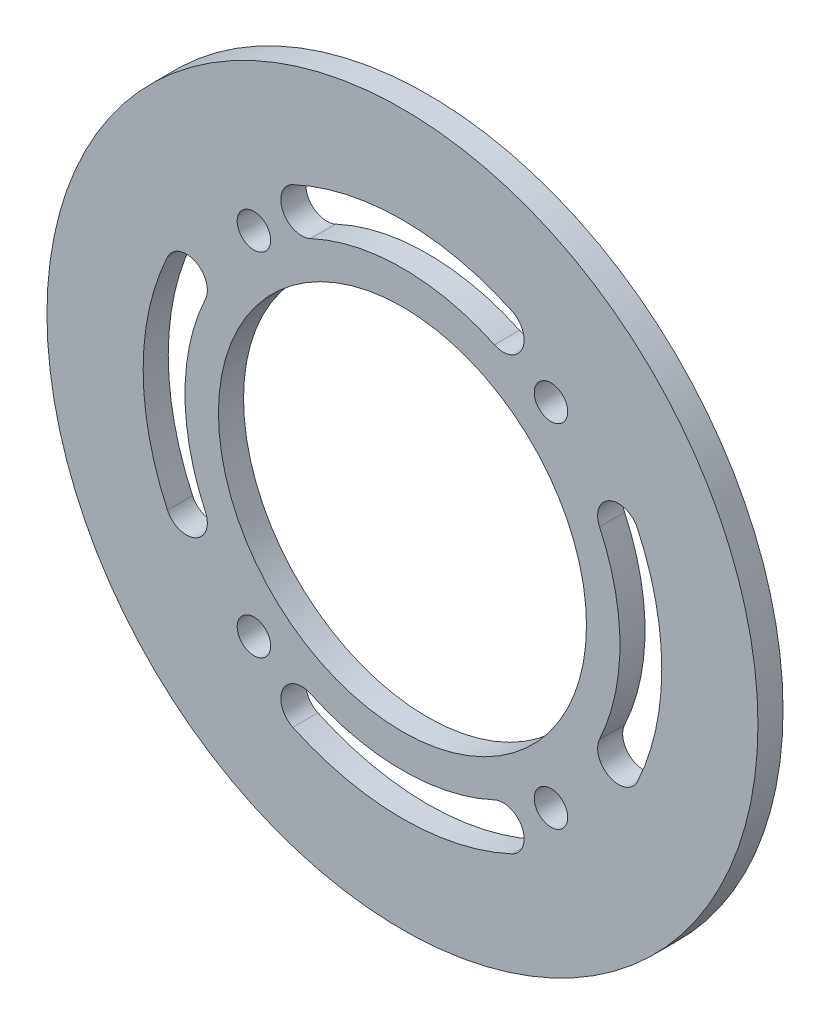
ISO-10303-21;
HEADER;
FILE_DESCRIPTION(('STEP AP214'),'2;1');
FILE_NAME('part.step','',(''),(''),'','','');
FILE_SCHEMA(('AUTOMOTIVE_DESIGN { 1 0 10303 214 1 1 1 1 }'));
ENDSEC;
DATA;
#1=APPLICATION_CONTEXT('core data for automotive mechanical design processes');
#2=APPLICATION_PROTOCOL_DEFINITION('international standard','automotive_design',2000,#1);
#3=PRODUCT_CONTEXT('',#1,'mechanical');
#4=PRODUCT('Part','Part','',(#3));
#5=PRODUCT_RELATED_PRODUCT_CATEGORY('part','',(#4));
#6=PRODUCT_DEFINITION_FORMATION('','',#4);
#7=PRODUCT_DEFINITION_CONTEXT('part definition',#1,'design');
#8=PRODUCT_DEFINITION('design','',#6,#7);
#9=PRODUCT_DEFINITION_SHAPE('','',#8);
#10=(LENGTH_UNIT() NAMED_UNIT(*) SI_UNIT(.MILLI.,.METRE.));
#11=(NAMED_UNIT(*) PLANE_ANGLE_UNIT() SI_UNIT($,.RADIAN.));
#12=(NAMED_UNIT(*) SI_UNIT($,.STERADIAN.) SOLID_ANGLE_UNIT());
#13=UNCERTAINTY_MEASURE_WITH_UNIT(LENGTH_MEASURE(1.E-05),#10,'distance_accuracy_value','');
#14=(GEOMETRIC_REPRESENTATION_CONTEXT(3) GLOBAL_UNCERTAINTY_ASSIGNED_CONTEXT((#13)) GLOBAL_UNIT_ASSIGNED_CONTEXT((#10,
#11,#12)) REPRESENTATION_CONTEXT('',''));
#15=CARTESIAN_POINT('',(0.,0.,0.));
#16=DIRECTION('',(0.,0.,1.));
#17=DIRECTION('',(1.,0.,0.));
#18=AXIS2_PLACEMENT_3D('',#15,#16,#17);
#19=CARTESIAN_POINT('',(0.,0.,20.));
#20=DIRECTION('',(0.,0.,-1.));
#21=DIRECTION('',(-1.,0.,0.));
#22=AXIS2_PLACEMENT_3D('',#19,#20,#21);
#23=CYLINDRICAL_SURFACE('',#22,22.);
#24=CARTESIAN_POINT('',(0.,0.,20.));
#25=DIRECTION('',(0.,0.,1.));
#26=DIRECTION('',(1.,0.,0.));
#27=AXIS2_PLACEMENT_3D('',#24,#25,#26);
#28=CIRCLE('',#27,22.);
#29=CARTESIAN_POINT('',(22.,0.,20.));
#30=VERTEX_POINT('',#29);
#31=EDGE_CURVE('E171',#30,#30,#28,.T.);
#32=ORIENTED_EDGE('',*,*,#31,.F.);
#33=EDGE_LOOP('',(#32));
#34=FACE_BOUND('',#33,.T.);
#35=CARTESIAN_POINT('',(0.,0.,23.));
#36=DIRECTION('',(0.,0.,1.));
#37=DIRECTION('',(1.,0.,0.));
#38=AXIS2_PLACEMENT_3D('',#35,#36,#37);
#39=CIRCLE('',#38,22.);
#40=CARTESIAN_POINT('',(22.,0.,23.));
#41=VERTEX_POINT('',#40);
#42=EDGE_CURVE('E307',#41,#41,#39,.T.);
#43=ORIENTED_EDGE('',*,*,#42,.T.);
#44=EDGE_LOOP('',(#43));
#45=FACE_BOUND('',#44,.T.);
#46=ADVANCED_FACE('F36',(#34,#45),#23,.F.);
#47=CARTESIAN_POINT('',(0.,0.,23.));
#48=DIRECTION('',(0.,0.,1.));
#49=DIRECTION('',(1.,0.,0.));
#50=AXIS2_PLACEMENT_3D('',#47,#48,#49);
#51=PLANE('',#50);
#52=CARTESIAN_POINT('',(-17.7552809045647,-21.,23.));
#53=DIRECTION('',(0.,0.,1.));
#54=DIRECTION('',(1.,0.,0.));
#55=AXIS2_PLACEMENT_3D('',#52,#53,#54);
#56=CIRCLE('',#55,2.00000000000001);
#57=CARTESIAN_POINT('',(-15.7552809045647,-21.,23.));
#58=VERTEX_POINT('',#57);
#59=EDGE_CURVE('E215',#58,#58,#56,.F.);
#60=ORIENTED_EDGE('',*,*,#59,.T.);
#61=EDGE_LOOP('',(#60));
#62=FACE_BOUND('',#61,.T.);
#63=CARTESIAN_POINT('',(17.7552809045647,21.,23.));
#64=DIRECTION('',(0.,0.,1.));
#65=DIRECTION('',(1.,0.,0.));
#66=AXIS2_PLACEMENT_3D('',#63,#64,#65);
#67=CIRCLE('',#66,2.00000000000001);
#68=CARTESIAN_POINT('',(19.7552809045647,21.,23.));
#69=VERTEX_POINT('',#68);
#70=EDGE_CURVE('E225',#69,#69,#67,.F.);
#71=ORIENTED_EDGE('',*,*,#70,.T.);
#72=EDGE_LOOP('',(#71));
#73=FACE_BOUND('',#72,.T.);
#74=CARTESIAN_POINT('',(-17.7552809045647,21.,23.));
#75=DIRECTION('',(0.,0.,1.));
#76=DIRECTION('',(1.,0.,0.));
#77=AXIS2_PLACEMENT_3D('',#74,#75,#76);
#78=CIRCLE('',#77,2.00000000000001);
#79=CARTESIAN_POINT('',(-15.7552809045647,21.,23.));
#80=VERTEX_POINT('',#79);
#81=EDGE_CURVE('E222',#80,#80,#78,.F.);
#82=ORIENTED_EDGE('',*,*,#81,.T.);
#83=EDGE_LOOP('',(#82));
#84=FACE_BOUND('',#83,.T.);
#85=CARTESIAN_POINT('',(17.7552809045647,-21.,23.));
#86=DIRECTION('',(0.,0.,1.));
#87=DIRECTION('',(1.,0.,0.));
#88=AXIS2_PLACEMENT_3D('',#85,#86,#87);
#89=CIRCLE('',#88,2.00000000000001);
#90=CARTESIAN_POINT('',(19.7552809045647,-21.,23.));
#91=VERTEX_POINT('',#90);
#92=EDGE_CURVE('E219',#91,#91,#89,.F.);
#93=ORIENTED_EDGE('',*,*,#92,.T.);
#94=EDGE_LOOP('',(#93));
#95=FACE_BOUND('',#94,.T.);
#96=CARTESIAN_POINT('',(25.8297719305445,-12.04462045961,23.));
#97=DIRECTION('',(0.,0.,1.));
#98=DIRECTION('',(1.,0.,0.));
#99=AXIS2_PLACEMENT_3D('',#96,#97,#98);
#100=CIRCLE('',#99,2.5);
#101=CARTESIAN_POINT('',(23.5640024629529,-10.9880748052582,23.));
#102=VERTEX_POINT('',#101);
#103=CARTESIAN_POINT('',(28.0955413981361,-13.1011661139617,23.));
#104=VERTEX_POINT('',#103);
#105=EDGE_CURVE('E305',#102,#104,#100,.T.);
#106=ORIENTED_EDGE('',*,*,#105,.F.);
#107=CARTESIAN_POINT('',(0.,0.,23.));
#108=DIRECTION('',(0.,0.,1.));
#109=DIRECTION('',(1.,0.,0.));
#110=AXIS2_PLACEMENT_3D('',#107,#108,#109);
#111=CIRCLE('',#110,26.);
#112=CARTESIAN_POINT('',(23.5640024629529,10.9880748052582,23.));
#113=VERTEX_POINT('',#112);
#114=EDGE_CURVE('E303',#113,#102,#111,.F.);
#115=ORIENTED_EDGE('',*,*,#114,.F.);
#116=CARTESIAN_POINT('',(25.8297719305445,12.04462045961,23.));
#117=DIRECTION('',(0.,0.,1.));
#118=DIRECTION('',(1.,0.,0.));
#119=AXIS2_PLACEMENT_3D('',#116,#117,#118);
#120=CIRCLE('',#119,2.5);
#121=CARTESIAN_POINT('',(28.0955413981361,13.1011661139617,23.));
#122=VERTEX_POINT('',#121);
#123=EDGE_CURVE('E301',#122,#113,#120,.T.);
#124=ORIENTED_EDGE('',*,*,#123,.F.);
#125=CARTESIAN_POINT('',(0.,0.,23.));
#126=DIRECTION('',(0.,0.,1.));
#127=DIRECTION('',(1.,0.,0.));
#128=AXIS2_PLACEMENT_3D('',#125,#126,#127);
#129=CIRCLE('',#128,31.);
#130=EDGE_CURVE('E299',#104,#122,#129,.T.);
#131=ORIENTED_EDGE('',*,*,#130,.F.);
#132=EDGE_LOOP('',(#106,#115,#124,#131));
#133=FACE_BOUND('',#132,.T.);
#134=CARTESIAN_POINT('',(-12.04462045961,-25.8297719305445,23.));
#135=DIRECTION('',(0.,0.,1.));
#136=DIRECTION('',(1.,0.,0.));
#137=AXIS2_PLACEMENT_3D('',#134,#135,#136);
#138=CIRCLE('',#137,2.5);
#139=CARTESIAN_POINT('',(-10.9880748052583,-23.5640024629528,23.));
#140=VERTEX_POINT('',#139);
#141=CARTESIAN_POINT('',(-13.1011661139617,-28.0955413981361,23.));
#142=VERTEX_POINT('',#141);
#143=EDGE_CURVE('E297',#140,#142,#138,.T.);
#144=ORIENTED_EDGE('',*,*,#143,.F.);
#145=CARTESIAN_POINT('',(0.,0.,23.));
#146=DIRECTION('',(0.,0.,1.));
#147=DIRECTION('',(1.,0.,0.));
#148=AXIS2_PLACEMENT_3D('',#145,#146,#147);
#149=CIRCLE('',#148,26.);
#150=CARTESIAN_POINT('',(10.9880748052581,-23.5640024629529,23.));
#151=VERTEX_POINT('',#150);
#152=EDGE_CURVE('E295',#151,#140,#149,.F.);
#153=ORIENTED_EDGE('',*,*,#152,.F.);
#154=CARTESIAN_POINT('',(12.04462045961,-25.8297719305445,23.));
#155=DIRECTION('',(0.,0.,1.));
#156=DIRECTION('',(1.,0.,0.));
#157=AXIS2_PLACEMENT_3D('',#154,#155,#156);
#158=CIRCLE('',#157,2.5);
#159=CARTESIAN_POINT('',(13.1011661139617,-28.0955413981361,23.));
#160=VERTEX_POINT('',#159);
#161=EDGE_CURVE('E293',#160,#151,#158,.T.);
#162=ORIENTED_EDGE('',*,*,#161,.F.);
#163=CARTESIAN_POINT('',(0.,0.,23.));
#164=DIRECTION('',(0.,0.,1.));
#165=DIRECTION('',(1.,0.,0.));
#166=AXIS2_PLACEMENT_3D('',#163,#164,#165);
#167=CIRCLE('',#166,31.);
#168=EDGE_CURVE('E291',#142,#160,#167,.T.);
#169=ORIENTED_EDGE('',*,*,#168,.F.);
#170=EDGE_LOOP('',(#144,#153,#162,#169));
#171=FACE_BOUND('',#170,.T.);
#172=CARTESIAN_POINT('',(-25.8297719305445,12.04462045961,23.));
#173=DIRECTION('',(0.,0.,1.));
#174=DIRECTION('',(1.,0.,0.));
#175=AXIS2_PLACEMENT_3D('',#172,#173,#174);
#176=CIRCLE('',#175,2.5);
#177=CARTESIAN_POINT('',(-23.5640024629528,10.9880748052584,23.));
#178=VERTEX_POINT('',#177);
#179=CARTESIAN_POINT('',(-28.0955413981361,13.1011661139617,23.));
#180=VERTEX_POINT('',#179);
#181=EDGE_CURVE('E288',#178,#180,#176,.T.);
#182=ORIENTED_EDGE('',*,*,#181,.F.);
#183=CARTESIAN_POINT('',(0.,0.,23.));
#184=DIRECTION('',(0.,0.,1.));
#185=DIRECTION('',(1.,0.,0.));
#186=AXIS2_PLACEMENT_3D('',#183,#184,#185);
#187=CIRCLE('',#186,26.);
#188=CARTESIAN_POINT('',(-23.564002462953,-10.9880748052581,23.));
#189=VERTEX_POINT('',#188);
#190=EDGE_CURVE('E286',#189,#178,#187,.F.);
#191=ORIENTED_EDGE('',*,*,#190,.F.);
#192=CARTESIAN_POINT('',(-25.8297719305445,-12.04462045961,23.));
#193=DIRECTION('',(0.,0.,1.));
#194=DIRECTION('',(1.,0.,0.));
#195=AXIS2_PLACEMENT_3D('',#192,#193,#194);
#196=CIRCLE('',#195,2.5);
#197=CARTESIAN_POINT('',(-28.0955413981361,-13.1011661139617,23.));
#198=VERTEX_POINT('',#197);
#199=EDGE_CURVE('E284',#198,#189,#196,.T.);
#200=ORIENTED_EDGE('',*,*,#199,.F.);
#201=CARTESIAN_POINT('',(0.,0.,23.));
#202=DIRECTION('',(0.,0.,1.));
#203=DIRECTION('',(1.,0.,0.));
#204=AXIS2_PLACEMENT_3D('',#201,#202,#203);
#205=CIRCLE('',#204,31.);
#206=EDGE_CURVE('E282',#180,#198,#205,.T.);
#207=ORIENTED_EDGE('',*,*,#206,.F.);
#208=EDGE_LOOP('',(#182,#191,#200,#207));
#209=FACE_BOUND('',#208,.T.);
#210=CARTESIAN_POINT('',(12.04462045961,25.8297719305445,23.));
#211=DIRECTION('',(0.,0.,1.));
#212=DIRECTION('',(1.,0.,0.));
#213=AXIS2_PLACEMENT_3D('',#210,#211,#212);
#214=CIRCLE('',#213,2.5);
#215=CARTESIAN_POINT('',(10.9880748052585,23.5640024629528,23.));
#216=VERTEX_POINT('',#215);
#217=CARTESIAN_POINT('',(13.1011661139617,28.0955413981361,23.));
#218=VERTEX_POINT('',#217);
#219=EDGE_CURVE('E169',#216,#218,#214,.T.);
#220=ORIENTED_EDGE('',*,*,#219,.F.);
#221=CARTESIAN_POINT('',(0.,0.,23.));
#222=DIRECTION('',(0.,0.,1.));
#223=DIRECTION('',(1.,0.,0.));
#224=AXIS2_PLACEMENT_3D('',#221,#222,#223);
#225=CIRCLE('',#224,26.);
#226=CARTESIAN_POINT('',(-10.988074805258,23.564002462953,23.));
#227=VERTEX_POINT('',#226);
#228=EDGE_CURVE('E279',#227,#216,#225,.F.);
#229=ORIENTED_EDGE('',*,*,#228,.F.);
#230=CARTESIAN_POINT('',(-12.04462045961,25.8297719305445,23.));
#231=DIRECTION('',(0.,0.,1.));
#232=DIRECTION('',(1.,0.,0.));
#233=AXIS2_PLACEMENT_3D('',#230,#231,#232);
#234=CIRCLE('',#233,2.5);
#235=CARTESIAN_POINT('',(-13.1011661139617,28.0955413981361,23.));
#236=VERTEX_POINT('',#235);
#237=EDGE_CURVE('E277',#236,#227,#234,.T.);
#238=ORIENTED_EDGE('',*,*,#237,.F.);
#239=CARTESIAN_POINT('',(0.,0.,23.));
#240=DIRECTION('',(0.,0.,1.));
#241=DIRECTION('',(1.,0.,0.));
#242=AXIS2_PLACEMENT_3D('',#239,#240,#241);
#243=CIRCLE('',#242,31.);
#244=EDGE_CURVE('E241',#218,#236,#243,.T.);
#245=ORIENTED_EDGE('',*,*,#244,.F.);
#246=EDGE_LOOP('',(#220,#229,#238,#245));
#247=FACE_BOUND('',#246,.T.);
#248=CARTESIAN_POINT('',(0.,0.,23.));
#249=DIRECTION('',(0.,0.,1.));
#250=DIRECTION('',(1.,0.,0.));
#251=AXIS2_PLACEMENT_3D('',#248,#249,#250);
#252=CIRCLE('',#251,42.5);
#253=CARTESIAN_POINT('',(42.5,0.,23.));
#254=VERTEX_POINT('',#253);
#255=EDGE_CURVE('E161',#254,#254,#252,.T.);
#256=ORIENTED_EDGE('',*,*,#255,.T.);
#257=EDGE_LOOP('',(#256));
#258=FACE_BOUND('',#257,.T.);
#259=ORIENTED_EDGE('',*,*,#42,.F.);
#260=EDGE_LOOP('',(#259));
#261=FACE_BOUND('',#260,.T.);
#262=ADVANCED_FACE('F322',(#62,#73,#84,#95,#133,#171,#209,#247,#258,#261),#51,.T.);
#263=CARTESIAN_POINT('',(0.,0.,20.));
#264=DIRECTION('',(0.,0.,1.));
#265=DIRECTION('',(1.,0.,0.));
#266=AXIS2_PLACEMENT_3D('',#263,#264,#265);
#267=PLANE('',#266);
#268=CARTESIAN_POINT('',(-17.7552809045647,-21.,20.));
#269=DIRECTION('',(0.,0.,1.));
#270=DIRECTION('',(1.,0.,0.));
#271=AXIS2_PLACEMENT_3D('',#268,#269,#270);
#272=CIRCLE('',#271,2.00000000000001);
#273=CARTESIAN_POINT('',(-15.7552809045647,-21.,20.));
#274=VERTEX_POINT('',#273);
#275=EDGE_CURVE('E39',#274,#274,#272,.F.);
#276=ORIENTED_EDGE('',*,*,#275,.F.);
#277=EDGE_LOOP('',(#276));
#278=FACE_BOUND('',#277,.T.);
#279=CARTESIAN_POINT('',(17.7552809045647,21.,20.));
#280=DIRECTION('',(0.,0.,1.));
#281=DIRECTION('',(1.,0.,0.));
#282=AXIS2_PLACEMENT_3D('',#279,#280,#281);
#283=CIRCLE('',#282,2.00000000000001);
#284=CARTESIAN_POINT('',(19.7552809045647,21.,20.));
#285=VERTEX_POINT('',#284);
#286=EDGE_CURVE('E223',#285,#285,#283,.F.);
#287=ORIENTED_EDGE('',*,*,#286,.F.);
#288=EDGE_LOOP('',(#287));
#289=FACE_BOUND('',#288,.T.);
#290=CARTESIAN_POINT('',(-17.7552809045647,21.,20.));
#291=DIRECTION('',(0.,0.,1.));
#292=DIRECTION('',(1.,0.,0.));
#293=AXIS2_PLACEMENT_3D('',#290,#291,#292);
#294=CIRCLE('',#293,2.00000000000001);
#295=CARTESIAN_POINT('',(-15.7552809045647,21.,20.));
#296=VERTEX_POINT('',#295);
#297=EDGE_CURVE('E220',#296,#296,#294,.F.);
#298=ORIENTED_EDGE('',*,*,#297,.F.);
#299=EDGE_LOOP('',(#298));
#300=FACE_BOUND('',#299,.T.);
#301=CARTESIAN_POINT('',(17.7552809045647,-21.,20.));
#302=DIRECTION('',(0.,0.,1.));
#303=DIRECTION('',(1.,0.,0.));
#304=AXIS2_PLACEMENT_3D('',#301,#302,#303);
#305=CIRCLE('',#304,2.00000000000001);
#306=CARTESIAN_POINT('',(19.7552809045647,-21.,20.));
#307=VERTEX_POINT('',#306);
#308=EDGE_CURVE('E216',#307,#307,#305,.F.);
#309=ORIENTED_EDGE('',*,*,#308,.F.);
#310=EDGE_LOOP('',(#309));
#311=FACE_BOUND('',#310,.T.);
#312=CARTESIAN_POINT('',(0.,0.,20.));
#313=DIRECTION('',(0.,0.,1.));
#314=DIRECTION('',(1.,0.,0.));
#315=AXIS2_PLACEMENT_3D('',#312,#313,#314);
#316=CIRCLE('',#315,26.);
#317=CARTESIAN_POINT('',(23.5640024629529,10.9880748052582,20.));
#318=VERTEX_POINT('',#317);
#319=CARTESIAN_POINT('',(23.5640024629529,-10.9880748052582,20.));
#320=VERTEX_POINT('',#319);
#321=EDGE_CURVE('E44',#318,#320,#316,.F.);
#322=ORIENTED_EDGE('',*,*,#321,.T.);
#323=CARTESIAN_POINT('',(25.8297719305445,-12.04462045961,20.));
#324=DIRECTION('',(0.,0.,1.));
#325=DIRECTION('',(1.,0.,0.));
#326=AXIS2_PLACEMENT_3D('',#323,#324,#325);
#327=CIRCLE('',#326,2.5);
#328=CARTESIAN_POINT('',(28.0955413981361,-13.1011661139617,20.));
#329=VERTEX_POINT('',#328);
#330=EDGE_CURVE('E11',#320,#329,#327,.T.);
#331=ORIENTED_EDGE('',*,*,#330,.T.);
#332=CARTESIAN_POINT('',(0.,0.,20.));
#333=DIRECTION('',(0.,0.,1.));
#334=DIRECTION('',(1.,0.,0.));
#335=AXIS2_PLACEMENT_3D('',#332,#333,#334);
#336=CIRCLE('',#335,31.);
#337=CARTESIAN_POINT('',(28.0955413981361,13.1011661139617,20.));
#338=VERTEX_POINT('',#337);
#339=EDGE_CURVE('E205',#329,#338,#336,.T.);
#340=ORIENTED_EDGE('',*,*,#339,.T.);
#341=CARTESIAN_POINT('',(25.8297719305445,12.04462045961,20.));
#342=DIRECTION('',(0.,0.,1.));
#343=DIRECTION('',(1.,0.,0.));
#344=AXIS2_PLACEMENT_3D('',#341,#342,#343);
#345=CIRCLE('',#344,2.5);
#346=EDGE_CURVE('E208',#338,#318,#345,.T.);
#347=ORIENTED_EDGE('',*,*,#346,.T.);
#348=EDGE_LOOP('',(#322,#331,#340,#347));
#349=FACE_BOUND('',#348,.T.);
#350=CARTESIAN_POINT('',(0.,0.,20.));
#351=DIRECTION('',(0.,0.,1.));
#352=DIRECTION('',(1.,0.,0.));
#353=AXIS2_PLACEMENT_3D('',#350,#351,#352);
#354=CIRCLE('',#353,26.);
#355=CARTESIAN_POINT('',(10.9880748052581,-23.5640024629529,20.));
#356=VERTEX_POINT('',#355);
#357=CARTESIAN_POINT('',(-10.9880748052583,-23.5640024629528,20.));
#358=VERTEX_POINT('',#357);
#359=EDGE_CURVE('E199',#356,#358,#354,.F.);
#360=ORIENTED_EDGE('',*,*,#359,.T.);
#361=CARTESIAN_POINT('',(-12.04462045961,-25.8297719305445,20.));
#362=DIRECTION('',(0.,0.,1.));
#363=DIRECTION('',(1.,0.,0.));
#364=AXIS2_PLACEMENT_3D('',#361,#362,#363);
#365=CIRCLE('',#364,2.5);
#366=CARTESIAN_POINT('',(-13.1011661139617,-28.0955413981361,20.));
#367=VERTEX_POINT('',#366);
#368=EDGE_CURVE('E202',#358,#367,#365,.T.);
#369=ORIENTED_EDGE('',*,*,#368,.T.);
#370=CARTESIAN_POINT('',(0.,0.,20.));
#371=DIRECTION('',(0.,0.,1.));
#372=DIRECTION('',(1.,0.,0.));
#373=AXIS2_PLACEMENT_3D('',#370,#371,#372);
#374=CIRCLE('',#373,31.);
#375=CARTESIAN_POINT('',(13.1011661139617,-28.0955413981361,20.));
#376=VERTEX_POINT('',#375);
#377=EDGE_CURVE('E193',#367,#376,#374,.T.);
#378=ORIENTED_EDGE('',*,*,#377,.T.);
#379=CARTESIAN_POINT('',(12.04462045961,-25.8297719305445,20.));
#380=DIRECTION('',(0.,0.,1.));
#381=DIRECTION('',(1.,0.,0.));
#382=AXIS2_PLACEMENT_3D('',#379,#380,#381);
#383=CIRCLE('',#382,2.5);
#384=EDGE_CURVE('E196',#376,#356,#383,.T.);
#385=ORIENTED_EDGE('',*,*,#384,.T.);
#386=EDGE_LOOP('',(#360,#369,#378,#385));
#387=FACE_BOUND('',#386,.T.);
#388=CARTESIAN_POINT('',(0.,0.,20.));
#389=DIRECTION('',(0.,0.,1.));
#390=DIRECTION('',(1.,0.,0.));
#391=AXIS2_PLACEMENT_3D('',#388,#389,#390);
#392=CIRCLE('',#391,26.);
#393=CARTESIAN_POINT('',(-23.564002462953,-10.9880748052581,20.));
#394=VERTEX_POINT('',#393);
#395=CARTESIAN_POINT('',(-23.5640024629528,10.9880748052584,20.));
#396=VERTEX_POINT('',#395);
#397=EDGE_CURVE('E187',#394,#396,#392,.F.);
#398=ORIENTED_EDGE('',*,*,#397,.T.);
#399=CARTESIAN_POINT('',(-25.8297719305445,12.04462045961,20.));
#400=DIRECTION('',(0.,0.,1.));
#401=DIRECTION('',(1.,0.,0.));
#402=AXIS2_PLACEMENT_3D('',#399,#400,#401);
#403=CIRCLE('',#402,2.5);
#404=CARTESIAN_POINT('',(-28.0955413981361,13.1011661139617,20.));
#405=VERTEX_POINT('',#404);
#406=EDGE_CURVE('E190',#396,#405,#403,.T.);
#407=ORIENTED_EDGE('',*,*,#406,.T.);
#408=CARTESIAN_POINT('',(0.,0.,20.));
#409=DIRECTION('',(0.,0.,1.));
#410=DIRECTION('',(1.,0.,0.));
#411=AXIS2_PLACEMENT_3D('',#408,#409,#410);
#412=CIRCLE('',#411,31.);
#413=CARTESIAN_POINT('',(-28.0955413981361,-13.1011661139617,20.));
#414=VERTEX_POINT('',#413);
#415=EDGE_CURVE('E177',#405,#414,#412,.T.);
#416=ORIENTED_EDGE('',*,*,#415,.T.);
#417=CARTESIAN_POINT('',(-25.8297719305445,-12.04462045961,20.));
#418=DIRECTION('',(0.,0.,1.));
#419=DIRECTION('',(1.,0.,0.));
#420=AXIS2_PLACEMENT_3D('',#417,#418,#419);
#421=CIRCLE('',#420,2.5);
#422=EDGE_CURVE('E180',#414,#394,#421,.T.);
#423=ORIENTED_EDGE('',*,*,#422,.T.);
#424=EDGE_LOOP('',(#398,#407,#416,#423));
#425=FACE_BOUND('',#424,.T.);
#426=CARTESIAN_POINT('',(0.,0.,20.));
#427=DIRECTION('',(0.,0.,1.));
#428=DIRECTION('',(1.,0.,0.));
#429=AXIS2_PLACEMENT_3D('',#426,#427,#428);
#430=CIRCLE('',#429,26.);
#431=CARTESIAN_POINT('',(-10.988074805258,23.564002462953,20.));
#432=VERTEX_POINT('',#431);
#433=CARTESIAN_POINT('',(10.9880748052585,23.5640024629528,20.));
#434=VERTEX_POINT('',#433);
#435=EDGE_CURVE('E176',#432,#434,#430,.F.);
#436=ORIENTED_EDGE('',*,*,#435,.T.);
#437=CARTESIAN_POINT('',(12.04462045961,25.8297719305445,20.));
#438=DIRECTION('',(0.,0.,1.));
#439=DIRECTION('',(1.,0.,0.));
#440=AXIS2_PLACEMENT_3D('',#437,#438,#439);
#441=CIRCLE('',#440,2.5);
#442=CARTESIAN_POINT('',(13.1011661139617,28.0955413981361,20.));
#443=VERTEX_POINT('',#442);
#444=EDGE_CURVE('E166',#434,#443,#441,.T.);
#445=ORIENTED_EDGE('',*,*,#444,.T.);
#446=CARTESIAN_POINT('',(0.,0.,20.));
#447=DIRECTION('',(0.,0.,1.));
#448=DIRECTION('',(1.,0.,0.));
#449=AXIS2_PLACEMENT_3D('',#446,#447,#448);
#450=CIRCLE('',#449,31.);
#451=CARTESIAN_POINT('',(-13.1011661139617,28.0955413981361,20.));
#452=VERTEX_POINT('',#451);
#453=EDGE_CURVE('E149',#443,#452,#450,.T.);
#454=ORIENTED_EDGE('',*,*,#453,.T.);
#455=CARTESIAN_POINT('',(-12.04462045961,25.8297719305445,20.));
#456=DIRECTION('',(0.,0.,1.));
#457=DIRECTION('',(1.,0.,0.));
#458=AXIS2_PLACEMENT_3D('',#455,#456,#457);
#459=CIRCLE('',#458,2.5);
#460=EDGE_CURVE('E160',#452,#432,#459,.T.);
#461=ORIENTED_EDGE('',*,*,#460,.T.);
#462=EDGE_LOOP('',(#436,#445,#454,#461));
#463=FACE_BOUND('',#462,.T.);
#464=CARTESIAN_POINT('',(0.,0.,20.));
#465=DIRECTION('',(0.,0.,1.));
#466=DIRECTION('',(1.,0.,0.));
#467=AXIS2_PLACEMENT_3D('',#464,#465,#466);
#468=CIRCLE('',#467,42.5);
#469=CARTESIAN_POINT('',(42.5,0.,20.));
#470=VERTEX_POINT('',#469);
#471=EDGE_CURVE('E310',#470,#470,#468,.T.);
#472=ORIENTED_EDGE('',*,*,#471,.F.);
#473=EDGE_LOOP('',(#472));
#474=FACE_BOUND('',#473,.T.);
#475=ORIENTED_EDGE('',*,*,#31,.T.);
#476=EDGE_LOOP('',(#475));
#477=FACE_BOUND('',#476,.T.);
#478=ADVANCED_FACE('F174',(#278,#289,#300,#311,#349,#387,#425,#463,#474,#477),#267,.F.);
#479=CARTESIAN_POINT('',(0.,0.,23.));
#480=DIRECTION('',(0.,0.,-1.));
#481=DIRECTION('',(-1.,0.,0.));
#482=AXIS2_PLACEMENT_3D('',#479,#480,#481);
#483=CYLINDRICAL_SURFACE('',#482,42.5);
#484=ORIENTED_EDGE('',*,*,#255,.F.);
#485=EDGE_LOOP('',(#484));
#486=FACE_BOUND('',#485,.T.);
#487=ORIENTED_EDGE('',*,*,#471,.T.);
#488=EDGE_LOOP('',(#487));
#489=FACE_BOUND('',#488,.T.);
#490=ADVANCED_FACE('F338',(#486,#489),#483,.T.);
#491=CARTESIAN_POINT('',(12.04462045961,25.8297719305445,18.));
#492=DIRECTION('',(0.,0.,1.));
#493=DIRECTION('',(1.,0.,0.));
#494=AXIS2_PLACEMENT_3D('',#491,#492,#493);
#495=CYLINDRICAL_SURFACE('',#494,2.5);
#496=ORIENTED_EDGE('',*,*,#219,.T.);
#497=DIRECTION('',(0.,0.,1.));
#498=VECTOR('',#497,1.);
#499=CARTESIAN_POINT('',(13.1011661139617,28.0955413981361,18.));
#500=LINE('',#499,#498);
#501=EDGE_CURVE('E152',#443,#218,#500,.T.);
#502=ORIENTED_EDGE('',*,*,#501,.F.);
#503=ORIENTED_EDGE('',*,*,#444,.F.);
#504=DIRECTION('',(0.,0.,1.));
#505=VECTOR('',#504,1.);
#506=CARTESIAN_POINT('',(10.9880748052585,23.5640024629528,18.));
#507=LINE('',#506,#505);
#508=EDGE_CURVE('E270',#434,#216,#507,.T.);
#509=ORIENTED_EDGE('',*,*,#508,.T.);
#510=EDGE_LOOP('',(#496,#502,#503,#509));
#511=FACE_BOUND('',#510,.T.);
#512=ADVANCED_FACE('F164',(#511),#495,.F.);
#513=CARTESIAN_POINT('',(0.,0.,18.));
#514=DIRECTION('',(0.,0.,1.));
#515=DIRECTION('',(1.,0.,0.));
#516=AXIS2_PLACEMENT_3D('',#513,#514,#515);
#517=CYLINDRICAL_SURFACE('',#516,26.);
#518=ORIENTED_EDGE('',*,*,#228,.T.);
#519=ORIENTED_EDGE('',*,*,#508,.F.);
#520=ORIENTED_EDGE('',*,*,#435,.F.);
#521=DIRECTION('',(0.,0.,1.));
#522=VECTOR('',#521,1.);
#523=CARTESIAN_POINT('',(-10.988074805258,23.564002462953,18.));
#524=LINE('',#523,#522);
#525=EDGE_CURVE('E272',#432,#227,#524,.T.);
#526=ORIENTED_EDGE('',*,*,#525,.T.);
#527=EDGE_LOOP('',(#518,#519,#520,#526));
#528=FACE_BOUND('',#527,.T.);
#529=ADVANCED_FACE('F320',(#528),#517,.T.);
#530=CARTESIAN_POINT('',(-12.04462045961,25.8297719305445,18.));
#531=DIRECTION('',(0.,0.,1.));
#532=DIRECTION('',(1.,0.,0.));
#533=AXIS2_PLACEMENT_3D('',#530,#531,#532);
#534=CYLINDRICAL_SURFACE('',#533,2.5);
#535=ORIENTED_EDGE('',*,*,#237,.T.);
#536=ORIENTED_EDGE('',*,*,#525,.F.);
#537=ORIENTED_EDGE('',*,*,#460,.F.);
#538=DIRECTION('',(0.,0.,1.));
#539=VECTOR('',#538,1.);
#540=CARTESIAN_POINT('',(-13.1011661139617,28.0955413981361,18.));
#541=LINE('',#540,#539);
#542=EDGE_CURVE('E155',#452,#236,#541,.T.);
#543=ORIENTED_EDGE('',*,*,#542,.T.);
#544=EDGE_LOOP('',(#535,#536,#537,#543));
#545=FACE_BOUND('',#544,.T.);
#546=ADVANCED_FACE('F316',(#545),#534,.F.);
#547=CARTESIAN_POINT('',(0.,0.,18.));
#548=DIRECTION('',(0.,0.,1.));
#549=DIRECTION('',(1.,0.,0.));
#550=AXIS2_PLACEMENT_3D('',#547,#548,#549);
#551=CYLINDRICAL_SURFACE('',#550,31.);
#552=ORIENTED_EDGE('',*,*,#244,.T.);
#553=ORIENTED_EDGE('',*,*,#542,.F.);
#554=ORIENTED_EDGE('',*,*,#453,.F.);
#555=ORIENTED_EDGE('',*,*,#501,.T.);
#556=EDGE_LOOP('',(#552,#553,#554,#555));
#557=FACE_BOUND('',#556,.T.);
#558=ADVANCED_FACE('F151',(#557),#551,.F.);
#559=CARTESIAN_POINT('',(-25.8297719305445,12.04462045961,18.));
#560=DIRECTION('',(0.,0.,1.));
#561=DIRECTION('',(1.,0.,0.));
#562=AXIS2_PLACEMENT_3D('',#559,#560,#561);
#563=CYLINDRICAL_SURFACE('',#562,2.5);
#564=ORIENTED_EDGE('',*,*,#181,.T.);
#565=DIRECTION('',(0.,0.,1.));
#566=VECTOR('',#565,1.);
#567=CARTESIAN_POINT('',(-28.0955413981361,13.1011661139617,18.));
#568=LINE('',#567,#566);
#569=EDGE_CURVE('E268',#405,#180,#568,.T.);
#570=ORIENTED_EDGE('',*,*,#569,.F.);
#571=ORIENTED_EDGE('',*,*,#406,.F.);
#572=DIRECTION('',(0.,0.,1.));
#573=VECTOR('',#572,1.);
#574=CARTESIAN_POINT('',(-23.5640024629528,10.9880748052584,18.));
#575=LINE('',#574,#573);
#576=EDGE_CURVE('E259',#396,#178,#575,.T.);
#577=ORIENTED_EDGE('',*,*,#576,.T.);
#578=EDGE_LOOP('',(#564,#570,#571,#577));
#579=FACE_BOUND('',#578,.T.);
#580=ADVANCED_FACE('F352',(#579),#563,.F.);
#581=CARTESIAN_POINT('',(0.,0.,18.));
#582=DIRECTION('',(0.,0.,1.));
#583=DIRECTION('',(1.,0.,0.));
#584=AXIS2_PLACEMENT_3D('',#581,#582,#583);
#585=CYLINDRICAL_SURFACE('',#584,26.);
#586=ORIENTED_EDGE('',*,*,#190,.T.);
#587=ORIENTED_EDGE('',*,*,#576,.F.);
#588=ORIENTED_EDGE('',*,*,#397,.F.);
#589=DIRECTION('',(0.,0.,1.));
#590=VECTOR('',#589,1.);
#591=CARTESIAN_POINT('',(-23.564002462953,-10.9880748052581,18.));
#592=LINE('',#591,#590);
#593=EDGE_CURVE('E262',#394,#189,#592,.T.);
#594=ORIENTED_EDGE('',*,*,#593,.T.);
#595=EDGE_LOOP('',(#586,#587,#588,#594));
#596=FACE_BOUND('',#595,.T.);
#597=ADVANCED_FACE('F359',(#596),#585,.T.);
#598=CARTESIAN_POINT('',(-25.8297719305445,-12.04462045961,18.));
#599=DIRECTION('',(0.,0.,1.));
#600=DIRECTION('',(1.,0.,0.));
#601=AXIS2_PLACEMENT_3D('',#598,#599,#600);
#602=CYLINDRICAL_SURFACE('',#601,2.5);
#603=ORIENTED_EDGE('',*,*,#199,.T.);
#604=ORIENTED_EDGE('',*,*,#593,.F.);
#605=ORIENTED_EDGE('',*,*,#422,.F.);
#606=DIRECTION('',(0.,0.,1.));
#607=VECTOR('',#606,1.);
#608=CARTESIAN_POINT('',(-28.0955413981361,-13.1011661139617,18.));
#609=LINE('',#608,#607);
#610=EDGE_CURVE('E265',#414,#198,#609,.T.);
#611=ORIENTED_EDGE('',*,*,#610,.T.);
#612=EDGE_LOOP('',(#603,#604,#605,#611));
#613=FACE_BOUND('',#612,.T.);
#614=ADVANCED_FACE('F365',(#613),#602,.F.);
#615=CARTESIAN_POINT('',(0.,0.,18.));
#616=DIRECTION('',(0.,0.,1.));
#617=DIRECTION('',(1.,0.,0.));
#618=AXIS2_PLACEMENT_3D('',#615,#616,#617);
#619=CYLINDRICAL_SURFACE('',#618,31.);
#620=ORIENTED_EDGE('',*,*,#206,.T.);
#621=ORIENTED_EDGE('',*,*,#610,.F.);
#622=ORIENTED_EDGE('',*,*,#415,.F.);
#623=ORIENTED_EDGE('',*,*,#569,.T.);
#624=EDGE_LOOP('',(#620,#621,#622,#623));
#625=FACE_BOUND('',#624,.T.);
#626=ADVANCED_FACE('F361',(#625),#619,.F.);
#627=CARTESIAN_POINT('',(-12.04462045961,-25.8297719305445,18.));
#628=DIRECTION('',(0.,0.,1.));
#629=DIRECTION('',(1.,0.,0.));
#630=AXIS2_PLACEMENT_3D('',#627,#628,#629);
#631=CYLINDRICAL_SURFACE('',#630,2.5);
#632=ORIENTED_EDGE('',*,*,#143,.T.);
#633=DIRECTION('',(0.,0.,1.));
#634=VECTOR('',#633,1.);
#635=CARTESIAN_POINT('',(-13.1011661139617,-28.0955413981361,18.));
#636=LINE('',#635,#634);
#637=EDGE_CURVE('E60',#367,#142,#636,.T.);
#638=ORIENTED_EDGE('',*,*,#637,.F.);
#639=ORIENTED_EDGE('',*,*,#368,.F.);
#640=DIRECTION('',(0.,0.,1.));
#641=VECTOR('',#640,1.);
#642=CARTESIAN_POINT('',(-10.9880748052583,-23.5640024629528,18.));
#643=LINE('',#642,#641);
#644=EDGE_CURVE('E249',#358,#140,#643,.T.);
#645=ORIENTED_EDGE('',*,*,#644,.T.);
#646=EDGE_LOOP('',(#632,#638,#639,#645));
#647=FACE_BOUND('',#646,.T.);
#648=ADVANCED_FACE('F364',(#647),#631,.F.);
#649=CARTESIAN_POINT('',(0.,0.,18.));
#650=DIRECTION('',(0.,0.,1.));
#651=DIRECTION('',(1.,0.,0.));
#652=AXIS2_PLACEMENT_3D('',#649,#650,#651);
#653=CYLINDRICAL_SURFACE('',#652,26.);
#654=ORIENTED_EDGE('',*,*,#152,.T.);
#655=ORIENTED_EDGE('',*,*,#644,.F.);
#656=ORIENTED_EDGE('',*,*,#359,.F.);
#657=DIRECTION('',(0.,0.,1.));
#658=VECTOR('',#657,1.);
#659=CARTESIAN_POINT('',(10.9880748052581,-23.5640024629529,18.));
#660=LINE('',#659,#658);
#661=EDGE_CURVE('E252',#356,#151,#660,.T.);
#662=ORIENTED_EDGE('',*,*,#661,.T.);
#663=EDGE_LOOP('',(#654,#655,#656,#662));
#664=FACE_BOUND('',#663,.T.);
#665=ADVANCED_FACE('F375',(#664),#653,.T.);
#666=CARTESIAN_POINT('',(12.04462045961,-25.8297719305445,18.));
#667=DIRECTION('',(0.,0.,1.));
#668=DIRECTION('',(1.,0.,0.));
#669=AXIS2_PLACEMENT_3D('',#666,#667,#668);
#670=CYLINDRICAL_SURFACE('',#669,2.5);
#671=ORIENTED_EDGE('',*,*,#161,.T.);
#672=ORIENTED_EDGE('',*,*,#661,.F.);
#673=ORIENTED_EDGE('',*,*,#384,.F.);
#674=DIRECTION('',(0.,0.,1.));
#675=VECTOR('',#674,1.);
#676=CARTESIAN_POINT('',(13.1011661139617,-28.0955413981361,18.));
#677=LINE('',#676,#675);
#678=EDGE_CURVE('E255',#376,#160,#677,.T.);
#679=ORIENTED_EDGE('',*,*,#678,.T.);
#680=EDGE_LOOP('',(#671,#672,#673,#679));
#681=FACE_BOUND('',#680,.T.);
#682=ADVANCED_FACE('F381',(#681),#670,.F.);
#683=CARTESIAN_POINT('',(0.,0.,18.));
#684=DIRECTION('',(0.,0.,1.));
#685=DIRECTION('',(1.,0.,0.));
#686=AXIS2_PLACEMENT_3D('',#683,#684,#685);
#687=CYLINDRICAL_SURFACE('',#686,31.);
#688=ORIENTED_EDGE('',*,*,#168,.T.);
#689=ORIENTED_EDGE('',*,*,#678,.F.);
#690=ORIENTED_EDGE('',*,*,#377,.F.);
#691=ORIENTED_EDGE('',*,*,#637,.T.);
#692=EDGE_LOOP('',(#688,#689,#690,#691));
#693=FACE_BOUND('',#692,.T.);
#694=ADVANCED_FACE('F377',(#693),#687,.F.);
#695=CARTESIAN_POINT('',(25.8297719305445,-12.04462045961,18.));
#696=DIRECTION('',(0.,0.,1.));
#697=DIRECTION('',(1.,0.,0.));
#698=AXIS2_PLACEMENT_3D('',#695,#696,#697);
#699=CYLINDRICAL_SURFACE('',#698,2.5);
#700=ORIENTED_EDGE('',*,*,#105,.T.);
#701=DIRECTION('',(0.,0.,1.));
#702=VECTOR('',#701,1.);
#703=CARTESIAN_POINT('',(28.0955413981361,-13.1011661139617,18.));
#704=LINE('',#703,#702);
#705=EDGE_CURVE('E52',#329,#104,#704,.T.);
#706=ORIENTED_EDGE('',*,*,#705,.F.);
#707=ORIENTED_EDGE('',*,*,#330,.F.);
#708=DIRECTION('',(0.,0.,1.));
#709=VECTOR('',#708,1.);
#710=CARTESIAN_POINT('',(23.5640024629529,-10.9880748052582,18.));
#711=LINE('',#710,#709);
#712=EDGE_CURVE('E238',#320,#102,#711,.T.);
#713=ORIENTED_EDGE('',*,*,#712,.T.);
#714=EDGE_LOOP('',(#700,#706,#707,#713));
#715=FACE_BOUND('',#714,.T.);
#716=ADVANCED_FACE('F380',(#715),#699,.F.);
#717=CARTESIAN_POINT('',(0.,0.,18.));
#718=DIRECTION('',(0.,0.,1.));
#719=DIRECTION('',(1.,0.,0.));
#720=AXIS2_PLACEMENT_3D('',#717,#718,#719);
#721=CYLINDRICAL_SURFACE('',#720,26.);
#722=ORIENTED_EDGE('',*,*,#114,.T.);
#723=ORIENTED_EDGE('',*,*,#712,.F.);
#724=ORIENTED_EDGE('',*,*,#321,.F.);
#725=DIRECTION('',(0.,0.,1.));
#726=VECTOR('',#725,1.);
#727=CARTESIAN_POINT('',(23.5640024629529,10.9880748052582,18.));
#728=LINE('',#727,#726);
#729=EDGE_CURVE('E242',#318,#113,#728,.T.);
#730=ORIENTED_EDGE('',*,*,#729,.T.);
#731=EDGE_LOOP('',(#722,#723,#724,#730));
#732=FACE_BOUND('',#731,.T.);
#733=ADVANCED_FACE('F390',(#732),#721,.T.);
#734=CARTESIAN_POINT('',(25.8297719305445,12.04462045961,18.));
#735=DIRECTION('',(0.,0.,1.));
#736=DIRECTION('',(1.,0.,0.));
#737=AXIS2_PLACEMENT_3D('',#734,#735,#736);
#738=CYLINDRICAL_SURFACE('',#737,2.5);
#739=ORIENTED_EDGE('',*,*,#123,.T.);
#740=ORIENTED_EDGE('',*,*,#729,.F.);
#741=ORIENTED_EDGE('',*,*,#346,.F.);
#742=DIRECTION('',(0.,0.,1.));
#743=VECTOR('',#742,1.);
#744=CARTESIAN_POINT('',(28.0955413981361,13.1011661139617,18.));
#745=LINE('',#744,#743);
#746=EDGE_CURVE('E245',#338,#122,#745,.T.);
#747=ORIENTED_EDGE('',*,*,#746,.T.);
#748=EDGE_LOOP('',(#739,#740,#741,#747));
#749=FACE_BOUND('',#748,.T.);
#750=ADVANCED_FACE('F396',(#749),#738,.F.);
#751=CARTESIAN_POINT('',(0.,0.,18.));
#752=DIRECTION('',(0.,0.,1.));
#753=DIRECTION('',(1.,0.,0.));
#754=AXIS2_PLACEMENT_3D('',#751,#752,#753);
#755=CYLINDRICAL_SURFACE('',#754,31.);
#756=ORIENTED_EDGE('',*,*,#130,.T.);
#757=ORIENTED_EDGE('',*,*,#746,.F.);
#758=ORIENTED_EDGE('',*,*,#339,.F.);
#759=ORIENTED_EDGE('',*,*,#705,.T.);
#760=EDGE_LOOP('',(#756,#757,#758,#759));
#761=FACE_BOUND('',#760,.T.);
#762=ADVANCED_FACE('F392',(#761),#755,.F.);
#763=CARTESIAN_POINT('',(17.7552809045647,-21.,30.));
#764=DIRECTION('',(0.,0.,-1.));
#765=DIRECTION('',(-1.,0.,0.));
#766=AXIS2_PLACEMENT_3D('',#763,#764,#765);
#767=CYLINDRICAL_SURFACE('',#766,2.00000000000001);
#768=ORIENTED_EDGE('',*,*,#92,.F.);
#769=EDGE_LOOP('',(#768));
#770=FACE_BOUND('',#769,.T.);
#771=ORIENTED_EDGE('',*,*,#308,.T.);
#772=EDGE_LOOP('',(#771));
#773=FACE_BOUND('',#772,.T.);
#774=ADVANCED_FACE('F395',(#770,#773),#767,.F.);
#775=CARTESIAN_POINT('',(-17.7552809045647,21.,30.));
#776=DIRECTION('',(0.,0.,-1.));
#777=DIRECTION('',(-1.,0.,0.));
#778=AXIS2_PLACEMENT_3D('',#775,#776,#777);
#779=CYLINDRICAL_SURFACE('',#778,2.00000000000001);
#780=ORIENTED_EDGE('',*,*,#81,.F.);
#781=EDGE_LOOP('',(#780));
#782=FACE_BOUND('',#781,.T.);
#783=ORIENTED_EDGE('',*,*,#297,.T.);
#784=EDGE_LOOP('',(#783));
#785=FACE_BOUND('',#784,.T.);
#786=ADVANCED_FACE('F405',(#782,#785),#779,.F.);
#787=CARTESIAN_POINT('',(17.7552809045647,21.,30.));
#788=DIRECTION('',(0.,0.,-1.));
#789=DIRECTION('',(-1.,0.,0.));
#790=AXIS2_PLACEMENT_3D('',#787,#788,#789);
#791=CYLINDRICAL_SURFACE('',#790,2.00000000000001);
#792=ORIENTED_EDGE('',*,*,#70,.F.);
#793=EDGE_LOOP('',(#792));
#794=FACE_BOUND('',#793,.T.);
#795=ORIENTED_EDGE('',*,*,#286,.T.);
#796=EDGE_LOOP('',(#795));
#797=FACE_BOUND('',#796,.T.);
#798=ADVANCED_FACE('F407',(#794,#797),#791,.F.);
#799=CARTESIAN_POINT('',(-17.7552809045647,-21.,30.));
#800=DIRECTION('',(0.,0.,-1.));
#801=DIRECTION('',(-1.,0.,0.));
#802=AXIS2_PLACEMENT_3D('',#799,#800,#801);
#803=CYLINDRICAL_SURFACE('',#802,2.00000000000001);
#804=ORIENTED_EDGE('',*,*,#59,.F.);
#805=EDGE_LOOP('',(#804));
#806=FACE_BOUND('',#805,.T.);
#807=ORIENTED_EDGE('',*,*,#275,.T.);
#808=EDGE_LOOP('',(#807));
#809=FACE_BOUND('',#808,.T.);
#810=ADVANCED_FACE('F410',(#806,#809),#803,.F.);
#811=CLOSED_SHELL('',(#46,#262,#478,#490,#512,#529,#546,#558,#580,#597,#614,#626,#648,#665,#682,
#694,#716,#733,#750,#762,#774,#786,#798,#810));
#812=MANIFOLD_SOLID_BREP('B2',#811);
#813=ADVANCED_BREP_SHAPE_REPRESENTATION('',(#18,#812),#14);
#814=SHAPE_DEFINITION_REPRESENTATION(#9,#813);
ENDSEC;
END-ISO-10303-21;
